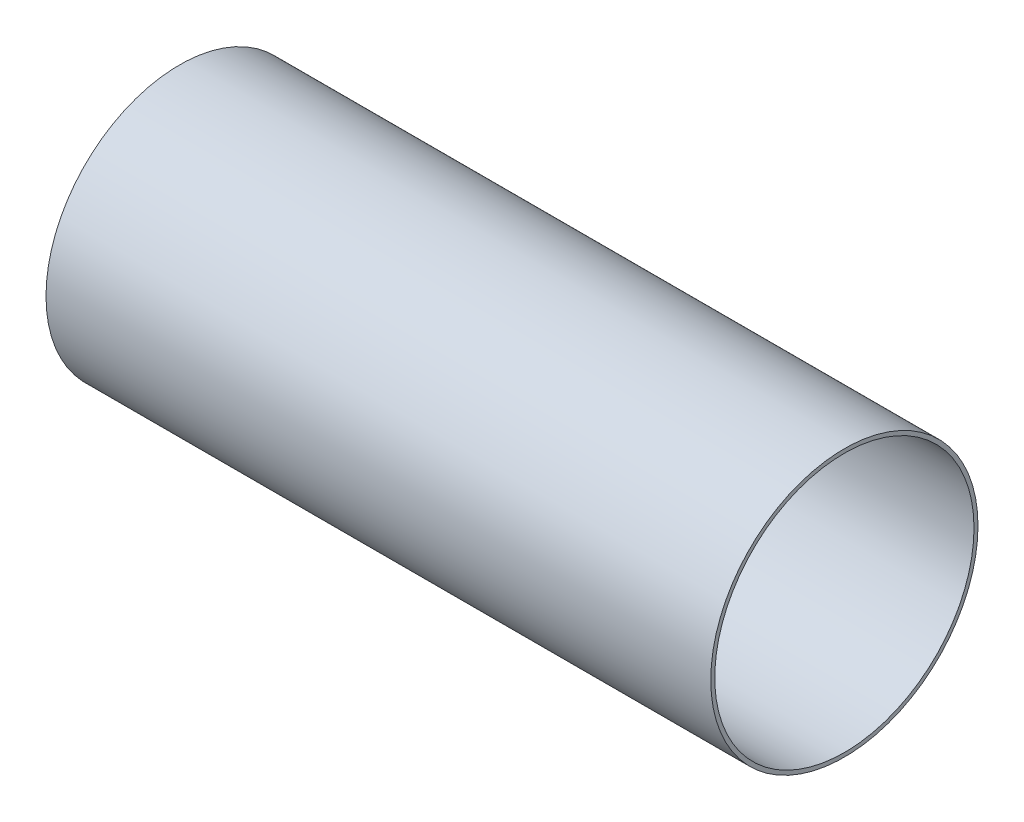
ISO-10303-21;
HEADER;
FILE_DESCRIPTION(('STEP AP214'),'2;1');
FILE_NAME('part.step','',(''),(''),'','','');
FILE_SCHEMA(('AUTOMOTIVE_DESIGN { 1 0 10303 214 1 1 1 1 }'));
ENDSEC;
DATA;
#1=APPLICATION_CONTEXT('core data for automotive mechanical design processes');
#2=APPLICATION_PROTOCOL_DEFINITION('international standard','automotive_design',2000,#1);
#3=PRODUCT_CONTEXT('',#1,'mechanical');
#4=PRODUCT('Part','Part','',(#3));
#5=PRODUCT_RELATED_PRODUCT_CATEGORY('part','',(#4));
#6=PRODUCT_DEFINITION_FORMATION('','',#4);
#7=PRODUCT_DEFINITION_CONTEXT('part definition',#1,'design');
#8=PRODUCT_DEFINITION('design','',#6,#7);
#9=PRODUCT_DEFINITION_SHAPE('','',#8);
#10=(LENGTH_UNIT() NAMED_UNIT(*) SI_UNIT(.MILLI.,.METRE.));
#11=(NAMED_UNIT(*) PLANE_ANGLE_UNIT() SI_UNIT($,.RADIAN.));
#12=(NAMED_UNIT(*) SI_UNIT($,.STERADIAN.) SOLID_ANGLE_UNIT());
#13=UNCERTAINTY_MEASURE_WITH_UNIT(LENGTH_MEASURE(1.E-05),#10,'distance_accuracy_value','');
#14=(GEOMETRIC_REPRESENTATION_CONTEXT(3) GLOBAL_UNCERTAINTY_ASSIGNED_CONTEXT((#13)) GLOBAL_UNIT_ASSIGNED_CONTEXT((#10,
#11,#12)) REPRESENTATION_CONTEXT('',''));
#15=CARTESIAN_POINT('',(0.,0.,0.));
#16=DIRECTION('',(0.,0.,1.));
#17=DIRECTION('',(1.,0.,0.));
#18=AXIS2_PLACEMENT_3D('',#15,#16,#17);
#19=CARTESIAN_POINT('',(-127.,0.,0.));
#20=DIRECTION('',(1.,0.,0.));
#21=DIRECTION('',(0.,0.,-1.));
#22=AXIS2_PLACEMENT_3D('',#19,#20,#21);
#23=CYLINDRICAL_SURFACE('',#22,51.054);
#24=CARTESIAN_POINT('',(-127.,0.,0.));
#25=DIRECTION('',(1.,0.,0.));
#26=DIRECTION('',(0.,0.,-1.));
#27=AXIS2_PLACEMENT_3D('',#24,#25,#26);
#28=CIRCLE('',#27,51.054);
#29=CARTESIAN_POINT('',(-127.,0.,-51.054));
#30=VERTEX_POINT('',#29);
#31=EDGE_CURVE('E10',#30,#30,#28,.T.);
#32=ORIENTED_EDGE('',*,*,#31,.T.);
#33=EDGE_LOOP('',(#32));
#34=FACE_BOUND('',#33,.T.);
#35=CARTESIAN_POINT('',(127.,0.,0.));
#36=DIRECTION('',(1.,0.,0.));
#37=DIRECTION('',(0.,0.,-1.));
#38=AXIS2_PLACEMENT_3D('',#35,#36,#37);
#39=CIRCLE('',#38,51.054);
#40=CARTESIAN_POINT('',(127.,0.,-51.054));
#41=VERTEX_POINT('',#40);
#42=EDGE_CURVE('E47',#41,#41,#39,.T.);
#43=ORIENTED_EDGE('',*,*,#42,.F.);
#44=EDGE_LOOP('',(#43));
#45=FACE_BOUND('',#44,.T.);
#46=ADVANCED_FACE('F37',(#34,#45),#23,.T.);
#47=CARTESIAN_POINT('',(-127.,0.,0.));
#48=DIRECTION('',(1.,0.,0.));
#49=DIRECTION('',(0.,0.,-1.));
#50=AXIS2_PLACEMENT_3D('',#47,#48,#49);
#51=PLANE('',#50);
#52=CARTESIAN_POINT('',(-127.,0.,0.));
#53=DIRECTION('',(1.,0.,0.));
#54=DIRECTION('',(0.,0.,-1.));
#55=AXIS2_PLACEMENT_3D('',#52,#53,#54);
#56=CIRCLE('',#55,49.53);
#57=CARTESIAN_POINT('',(-127.,0.,-49.53));
#58=VERTEX_POINT('',#57);
#59=EDGE_CURVE('E43',#58,#58,#56,.T.);
#60=ORIENTED_EDGE('',*,*,#59,.T.);
#61=EDGE_LOOP('',(#60));
#62=FACE_BOUND('',#61,.T.);
#63=ORIENTED_EDGE('',*,*,#31,.F.);
#64=EDGE_LOOP('',(#63));
#65=FACE_BOUND('',#64,.T.);
#66=ADVANCED_FACE('F66',(#62,#65),#51,.F.);
#67=CARTESIAN_POINT('',(-127.,0.,0.));
#68=DIRECTION('',(1.,0.,0.));
#69=DIRECTION('',(0.,0.,-1.));
#70=AXIS2_PLACEMENT_3D('',#67,#68,#69);
#71=CYLINDRICAL_SURFACE('',#70,49.53);
#72=ORIENTED_EDGE('',*,*,#59,.F.);
#73=EDGE_LOOP('',(#72));
#74=FACE_BOUND('',#73,.T.);
#75=CARTESIAN_POINT('',(127.,0.,0.));
#76=DIRECTION('',(1.,0.,0.));
#77=DIRECTION('',(0.,0.,-1.));
#78=AXIS2_PLACEMENT_3D('',#75,#76,#77);
#79=CIRCLE('',#78,49.53);
#80=CARTESIAN_POINT('',(127.,0.,-49.53));
#81=VERTEX_POINT('',#80);
#82=EDGE_CURVE('E51',#81,#81,#79,.T.);
#83=ORIENTED_EDGE('',*,*,#82,.T.);
#84=EDGE_LOOP('',(#83));
#85=FACE_BOUND('',#84,.T.);
#86=ADVANCED_FACE('F57',(#74,#85),#71,.F.);
#87=CARTESIAN_POINT('',(127.,0.,0.));
#88=DIRECTION('',(1.,0.,0.));
#89=DIRECTION('',(0.,0.,-1.));
#90=AXIS2_PLACEMENT_3D('',#87,#88,#89);
#91=PLANE('',#90);
#92=ORIENTED_EDGE('',*,*,#42,.T.);
#93=EDGE_LOOP('',(#92));
#94=FACE_BOUND('',#93,.T.);
#95=ORIENTED_EDGE('',*,*,#82,.F.);
#96=EDGE_LOOP('',(#95));
#97=FACE_BOUND('',#96,.T.);
#98=ADVANCED_FACE('F59',(#94,#97),#91,.T.);
#99=CLOSED_SHELL('',(#46,#66,#86,#98));
#100=MANIFOLD_SOLID_BREP('B2',#99);
#101=ADVANCED_BREP_SHAPE_REPRESENTATION('',(#18,#100),#14);
#102=SHAPE_DEFINITION_REPRESENTATION(#9,#101);
ENDSEC;
END-ISO-10303-21;
